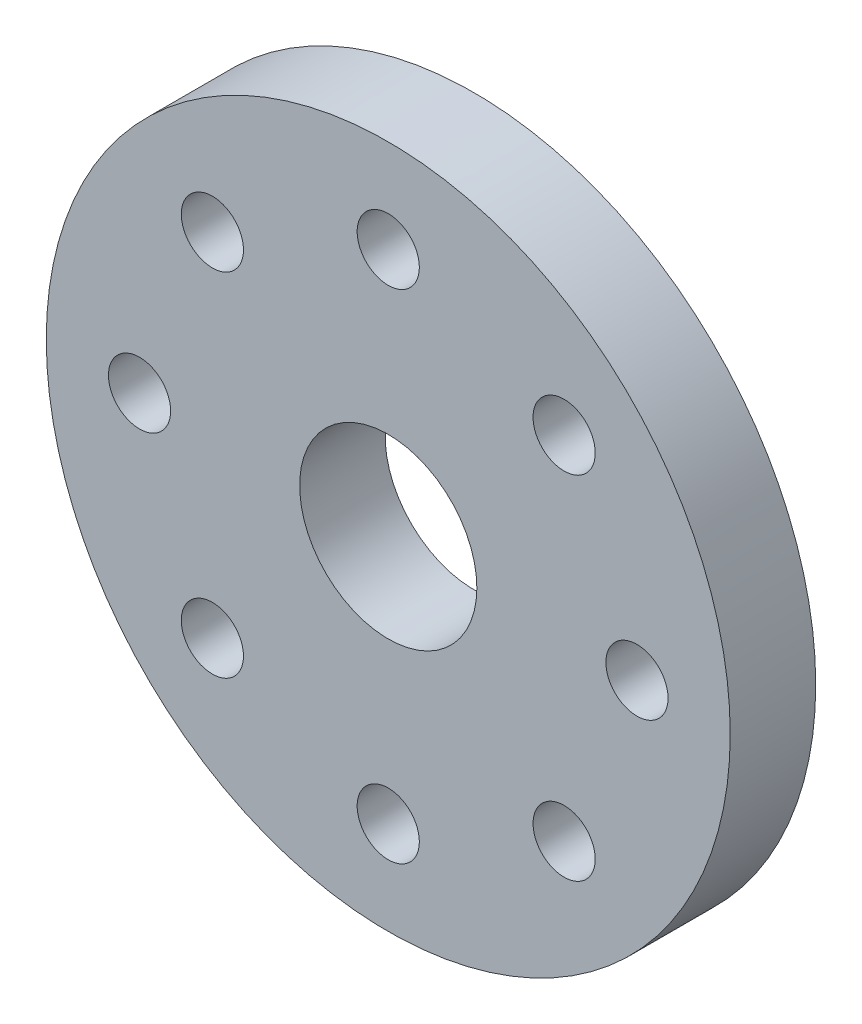
ISO-10303-21;
HEADER;
FILE_DESCRIPTION(('STEP AP214'),'2;1');
FILE_NAME('part.step','',(''),(''),'','','');
FILE_SCHEMA(('AUTOMOTIVE_DESIGN { 1 0 10303 214 1 1 1 1 }'));
ENDSEC;
DATA;
#1=APPLICATION_CONTEXT('core data for automotive mechanical design processes');
#2=APPLICATION_PROTOCOL_DEFINITION('international standard','automotive_design',2000,#1);
#3=PRODUCT_CONTEXT('',#1,'mechanical');
#4=PRODUCT('Part','Part','',(#3));
#5=PRODUCT_RELATED_PRODUCT_CATEGORY('part','',(#4));
#6=PRODUCT_DEFINITION_FORMATION('','',#4);
#7=PRODUCT_DEFINITION_CONTEXT('part definition',#1,'design');
#8=PRODUCT_DEFINITION('design','',#6,#7);
#9=PRODUCT_DEFINITION_SHAPE('','',#8);
#10=(LENGTH_UNIT() NAMED_UNIT(*) SI_UNIT(.MILLI.,.METRE.));
#11=(NAMED_UNIT(*) PLANE_ANGLE_UNIT() SI_UNIT($,.RADIAN.));
#12=(NAMED_UNIT(*) SI_UNIT($,.STERADIAN.) SOLID_ANGLE_UNIT());
#13=UNCERTAINTY_MEASURE_WITH_UNIT(LENGTH_MEASURE(1.E-05),#10,'distance_accuracy_value','');
#14=(GEOMETRIC_REPRESENTATION_CONTEXT(3) GLOBAL_UNCERTAINTY_ASSIGNED_CONTEXT((#13)) GLOBAL_UNIT_ASSIGNED_CONTEXT((#10,
#11,#12)) REPRESENTATION_CONTEXT('',''));
#15=CARTESIAN_POINT('',(0.,0.,0.));
#16=DIRECTION('',(0.,0.,1.));
#17=DIRECTION('',(1.,0.,0.));
#18=AXIS2_PLACEMENT_3D('',#15,#16,#17);
#19=CARTESIAN_POINT('',(0.,0.,2.75));
#20=DIRECTION('',(0.,0.,1.));
#21=DIRECTION('',(1.,0.,0.));
#22=AXIS2_PLACEMENT_3D('',#19,#20,#21);
#23=PLANE('',#22);
#24=CARTESIAN_POINT('',(0.,8.,2.75));
#25=DIRECTION('',(0.,0.,1.));
#26=DIRECTION('',(1.,0.,0.));
#27=AXIS2_PLACEMENT_3D('',#24,#25,#26);
#28=CIRCLE('',#27,1.);
#29=CARTESIAN_POINT('',(1.,8.,2.75));
#30=VERTEX_POINT('',#29);
#31=EDGE_CURVE('E122',#30,#30,#28,.T.);
#32=ORIENTED_EDGE('',*,*,#31,.F.);
#33=EDGE_LOOP('',(#32));
#34=FACE_BOUND('',#33,.T.);
#35=CARTESIAN_POINT('',(5.65685424949239,5.65685424949237,2.75));
#36=DIRECTION('',(0.,0.,1.));
#37=DIRECTION('',(1.,0.,0.));
#38=AXIS2_PLACEMENT_3D('',#35,#36,#37);
#39=CIRCLE('',#38,1.);
#40=CARTESIAN_POINT('',(6.65685424949239,5.65685424949237,2.75));
#41=VERTEX_POINT('',#40);
#42=EDGE_CURVE('E118',#41,#41,#39,.T.);
#43=ORIENTED_EDGE('',*,*,#42,.F.);
#44=EDGE_LOOP('',(#43));
#45=FACE_BOUND('',#44,.T.);
#46=CARTESIAN_POINT('',(8.,0.,2.75));
#47=DIRECTION('',(0.,0.,1.));
#48=DIRECTION('',(1.,0.,0.));
#49=AXIS2_PLACEMENT_3D('',#46,#47,#48);
#50=CIRCLE('',#49,1.);
#51=CARTESIAN_POINT('',(9.,0.,2.75));
#52=VERTEX_POINT('',#51);
#53=EDGE_CURVE('E110',#52,#52,#50,.T.);
#54=ORIENTED_EDGE('',*,*,#53,.F.);
#55=EDGE_LOOP('',(#54));
#56=FACE_BOUND('',#55,.T.);
#57=CARTESIAN_POINT('',(5.65685424949235,-5.65685424949241,2.75));
#58=DIRECTION('',(0.,0.,1.));
#59=DIRECTION('',(1.,0.,0.));
#60=AXIS2_PLACEMENT_3D('',#57,#58,#59);
#61=CIRCLE('',#60,1.);
#62=CARTESIAN_POINT('',(6.65685424949235,-5.65685424949241,2.75));
#63=VERTEX_POINT('',#62);
#64=EDGE_CURVE('E102',#63,#63,#61,.T.);
#65=ORIENTED_EDGE('',*,*,#64,.F.);
#66=EDGE_LOOP('',(#65));
#67=FACE_BOUND('',#66,.T.);
#68=CARTESIAN_POINT('',(0.,-8.,2.75));
#69=DIRECTION('',(0.,0.,1.));
#70=DIRECTION('',(1.,0.,0.));
#71=AXIS2_PLACEMENT_3D('',#68,#69,#70);
#72=CIRCLE('',#71,1.);
#73=CARTESIAN_POINT('',(0.999999999999944,-8.,2.75));
#74=VERTEX_POINT('',#73);
#75=EDGE_CURVE('E94',#74,#74,#72,.T.);
#76=ORIENTED_EDGE('',*,*,#75,.F.);
#77=EDGE_LOOP('',(#76));
#78=FACE_BOUND('',#77,.T.);
#79=CARTESIAN_POINT('',(-5.65685424949243,-5.65685424949233,2.75));
#80=DIRECTION('',(0.,0.,1.));
#81=DIRECTION('',(1.,0.,0.));
#82=AXIS2_PLACEMENT_3D('',#79,#80,#81);
#83=CIRCLE('',#82,1.);
#84=CARTESIAN_POINT('',(-4.65685424949243,-5.65685424949233,2.75));
#85=VERTEX_POINT('',#84);
#86=EDGE_CURVE('E86',#85,#85,#83,.T.);
#87=ORIENTED_EDGE('',*,*,#86,.F.);
#88=EDGE_LOOP('',(#87));
#89=FACE_BOUND('',#88,.T.);
#90=CARTESIAN_POINT('',(-8.,0.,2.75));
#91=DIRECTION('',(0.,0.,1.));
#92=DIRECTION('',(1.,0.,0.));
#93=AXIS2_PLACEMENT_3D('',#90,#91,#92);
#94=CIRCLE('',#93,1.);
#95=CARTESIAN_POINT('',(-7.,0.,2.75));
#96=VERTEX_POINT('',#95);
#97=EDGE_CURVE('E78',#96,#96,#94,.T.);
#98=ORIENTED_EDGE('',*,*,#97,.F.);
#99=EDGE_LOOP('',(#98));
#100=FACE_BOUND('',#99,.T.);
#101=CARTESIAN_POINT('',(-5.65685424949231,5.65685424949245,2.75));
#102=DIRECTION('',(0.,0.,1.));
#103=DIRECTION('',(1.,0.,0.));
#104=AXIS2_PLACEMENT_3D('',#101,#102,#103);
#105=CIRCLE('',#104,1.);
#106=CARTESIAN_POINT('',(-4.65685424949231,5.65685424949245,2.75));
#107=VERTEX_POINT('',#106);
#108=EDGE_CURVE('E70',#107,#107,#105,.T.);
#109=ORIENTED_EDGE('',*,*,#108,.F.);
#110=EDGE_LOOP('',(#109));
#111=FACE_BOUND('',#110,.T.);
#112=CARTESIAN_POINT('',(0.,0.,2.75));
#113=DIRECTION('',(0.,0.,1.));
#114=DIRECTION('',(1.,0.,0.));
#115=AXIS2_PLACEMENT_3D('',#112,#113,#114);
#116=CIRCLE('',#115,11.);
#117=CARTESIAN_POINT('',(11.,0.,2.75));
#118=VERTEX_POINT('',#117);
#119=EDGE_CURVE('E10',#118,#118,#116,.T.);
#120=ORIENTED_EDGE('',*,*,#119,.T.);
#121=EDGE_LOOP('',(#120));
#122=FACE_BOUND('',#121,.T.);
#123=CARTESIAN_POINT('',(0.,0.,2.75));
#124=DIRECTION('',(0.,0.,1.));
#125=DIRECTION('',(1.,0.,0.));
#126=AXIS2_PLACEMENT_3D('',#123,#124,#125);
#127=CIRCLE('',#126,2.85);
#128=CARTESIAN_POINT('',(2.85,0.,2.75));
#129=VERTEX_POINT('',#128);
#130=EDGE_CURVE('E56',#129,#129,#127,.T.);
#131=ORIENTED_EDGE('',*,*,#130,.F.);
#132=EDGE_LOOP('',(#131));
#133=FACE_BOUND('',#132,.T.);
#134=ADVANCED_FACE('F43',(#34,#45,#56,#67,#78,#89,#100,#111,#122,#133),#23,.T.);
#135=CARTESIAN_POINT('',(0.,0.,0.));
#136=DIRECTION('',(0.,0.,1.));
#137=DIRECTION('',(1.,0.,0.));
#138=AXIS2_PLACEMENT_3D('',#135,#136,#137);
#139=PLANE('',#138);
#140=CARTESIAN_POINT('',(0.,8.,0.));
#141=DIRECTION('',(0.,0.,1.));
#142=DIRECTION('',(1.,0.,0.));
#143=AXIS2_PLACEMENT_3D('',#140,#141,#142);
#144=CIRCLE('',#143,1.);
#145=CARTESIAN_POINT('',(1.,8.,0.));
#146=VERTEX_POINT('',#145);
#147=EDGE_CURVE('E62',#146,#146,#144,.T.);
#148=ORIENTED_EDGE('',*,*,#147,.T.);
#149=EDGE_LOOP('',(#148));
#150=FACE_BOUND('',#149,.T.);
#151=CARTESIAN_POINT('',(5.65685424949239,5.65685424949237,0.));
#152=DIRECTION('',(0.,0.,1.));
#153=DIRECTION('',(1.,0.,0.));
#154=AXIS2_PLACEMENT_3D('',#151,#152,#153);
#155=CIRCLE('',#154,1.);
#156=CARTESIAN_POINT('',(6.65685424949239,5.65685424949237,0.));
#157=VERTEX_POINT('',#156);
#158=EDGE_CURVE('E114',#157,#157,#155,.T.);
#159=ORIENTED_EDGE('',*,*,#158,.T.);
#160=EDGE_LOOP('',(#159));
#161=FACE_BOUND('',#160,.T.);
#162=CARTESIAN_POINT('',(8.,0.,0.));
#163=DIRECTION('',(0.,0.,1.));
#164=DIRECTION('',(1.,0.,0.));
#165=AXIS2_PLACEMENT_3D('',#162,#163,#164);
#166=CIRCLE('',#165,1.);
#167=CARTESIAN_POINT('',(9.,0.,0.));
#168=VERTEX_POINT('',#167);
#169=EDGE_CURVE('E106',#168,#168,#166,.T.);
#170=ORIENTED_EDGE('',*,*,#169,.T.);
#171=EDGE_LOOP('',(#170));
#172=FACE_BOUND('',#171,.T.);
#173=CARTESIAN_POINT('',(5.65685424949235,-5.65685424949241,0.));
#174=DIRECTION('',(0.,0.,1.));
#175=DIRECTION('',(1.,0.,0.));
#176=AXIS2_PLACEMENT_3D('',#173,#174,#175);
#177=CIRCLE('',#176,1.);
#178=CARTESIAN_POINT('',(6.65685424949235,-5.65685424949241,0.));
#179=VERTEX_POINT('',#178);
#180=EDGE_CURVE('E98',#179,#179,#177,.T.);
#181=ORIENTED_EDGE('',*,*,#180,.T.);
#182=EDGE_LOOP('',(#181));
#183=FACE_BOUND('',#182,.T.);
#184=CARTESIAN_POINT('',(0.,-8.,0.));
#185=DIRECTION('',(0.,0.,1.));
#186=DIRECTION('',(1.,0.,0.));
#187=AXIS2_PLACEMENT_3D('',#184,#185,#186);
#188=CIRCLE('',#187,1.);
#189=CARTESIAN_POINT('',(0.999999999999944,-8.,0.));
#190=VERTEX_POINT('',#189);
#191=EDGE_CURVE('E90',#190,#190,#188,.T.);
#192=ORIENTED_EDGE('',*,*,#191,.T.);
#193=EDGE_LOOP('',(#192));
#194=FACE_BOUND('',#193,.T.);
#195=CARTESIAN_POINT('',(-5.65685424949243,-5.65685424949233,0.));
#196=DIRECTION('',(0.,0.,1.));
#197=DIRECTION('',(1.,0.,0.));
#198=AXIS2_PLACEMENT_3D('',#195,#196,#197);
#199=CIRCLE('',#198,1.);
#200=CARTESIAN_POINT('',(-4.65685424949243,-5.65685424949233,0.));
#201=VERTEX_POINT('',#200);
#202=EDGE_CURVE('E82',#201,#201,#199,.T.);
#203=ORIENTED_EDGE('',*,*,#202,.T.);
#204=EDGE_LOOP('',(#203));
#205=FACE_BOUND('',#204,.T.);
#206=CARTESIAN_POINT('',(-8.,0.,0.));
#207=DIRECTION('',(0.,0.,1.));
#208=DIRECTION('',(1.,0.,0.));
#209=AXIS2_PLACEMENT_3D('',#206,#207,#208);
#210=CIRCLE('',#209,1.);
#211=CARTESIAN_POINT('',(-7.,0.,0.));
#212=VERTEX_POINT('',#211);
#213=EDGE_CURVE('E74',#212,#212,#210,.T.);
#214=ORIENTED_EDGE('',*,*,#213,.T.);
#215=EDGE_LOOP('',(#214));
#216=FACE_BOUND('',#215,.T.);
#217=CARTESIAN_POINT('',(-5.65685424949231,5.65685424949245,0.));
#218=DIRECTION('',(0.,0.,1.));
#219=DIRECTION('',(1.,0.,0.));
#220=AXIS2_PLACEMENT_3D('',#217,#218,#219);
#221=CIRCLE('',#220,1.);
#222=CARTESIAN_POINT('',(-4.65685424949231,5.65685424949245,0.));
#223=VERTEX_POINT('',#222);
#224=EDGE_CURVE('E66',#223,#223,#221,.T.);
#225=ORIENTED_EDGE('',*,*,#224,.T.);
#226=EDGE_LOOP('',(#225));
#227=FACE_BOUND('',#226,.T.);
#228=CARTESIAN_POINT('',(0.,0.,0.));
#229=DIRECTION('',(0.,0.,1.));
#230=DIRECTION('',(1.,0.,0.));
#231=AXIS2_PLACEMENT_3D('',#228,#229,#230);
#232=CIRCLE('',#231,11.);
#233=CARTESIAN_POINT('',(11.,0.,0.));
#234=VERTEX_POINT('',#233);
#235=EDGE_CURVE('E47',#234,#234,#232,.T.);
#236=ORIENTED_EDGE('',*,*,#235,.F.);
#237=EDGE_LOOP('',(#236));
#238=FACE_BOUND('',#237,.T.);
#239=CARTESIAN_POINT('',(0.,0.,0.));
#240=DIRECTION('',(0.,0.,1.));
#241=DIRECTION('',(1.,0.,0.));
#242=AXIS2_PLACEMENT_3D('',#239,#240,#241);
#243=CIRCLE('',#242,2.85);
#244=CARTESIAN_POINT('',(2.85,0.,0.));
#245=VERTEX_POINT('',#244);
#246=EDGE_CURVE('E58',#245,#245,#243,.T.);
#247=ORIENTED_EDGE('',*,*,#246,.T.);
#248=EDGE_LOOP('',(#247));
#249=FACE_BOUND('',#248,.T.);
#250=ADVANCED_FACE('F130',(#150,#161,#172,#183,#194,#205,#216,#227,#238,#249),#139,.F.);
#251=CARTESIAN_POINT('',(0.,0.,2.75));
#252=DIRECTION('',(0.,0.,-1.));
#253=DIRECTION('',(-1.,0.,0.));
#254=AXIS2_PLACEMENT_3D('',#251,#252,#253);
#255=CYLINDRICAL_SURFACE('',#254,11.);
#256=ORIENTED_EDGE('',*,*,#119,.F.);
#257=EDGE_LOOP('',(#256));
#258=FACE_BOUND('',#257,.T.);
#259=ORIENTED_EDGE('',*,*,#235,.T.);
#260=EDGE_LOOP('',(#259));
#261=FACE_BOUND('',#260,.T.);
#262=ADVANCED_FACE('F45',(#258,#261),#255,.T.);
#263=CARTESIAN_POINT('',(0.,0.,2.75));
#264=DIRECTION('',(0.,0.,-1.));
#265=DIRECTION('',(-1.,0.,0.));
#266=AXIS2_PLACEMENT_3D('',#263,#264,#265);
#267=CYLINDRICAL_SURFACE('',#266,2.85);
#268=ORIENTED_EDGE('',*,*,#130,.T.);
#269=EDGE_LOOP('',(#268));
#270=FACE_BOUND('',#269,.T.);
#271=ORIENTED_EDGE('',*,*,#246,.F.);
#272=EDGE_LOOP('',(#271));
#273=FACE_BOUND('',#272,.T.);
#274=ADVANCED_FACE('F159',(#270,#273),#267,.F.);
#275=CARTESIAN_POINT('',(-5.65685424949231,5.65685424949245,0.));
#276=DIRECTION('',(0.,0.,1.));
#277=DIRECTION('',(1.,0.,0.));
#278=AXIS2_PLACEMENT_3D('',#275,#276,#277);
#279=CYLINDRICAL_SURFACE('',#278,1.);
#280=ORIENTED_EDGE('',*,*,#224,.F.);
#281=EDGE_LOOP('',(#280));
#282=FACE_BOUND('',#281,.T.);
#283=ORIENTED_EDGE('',*,*,#108,.T.);
#284=EDGE_LOOP('',(#283));
#285=FACE_BOUND('',#284,.T.);
#286=ADVANCED_FACE('F162',(#282,#285),#279,.F.);
#287=CARTESIAN_POINT('',(-8.,0.,0.));
#288=DIRECTION('',(0.,0.,1.));
#289=DIRECTION('',(1.,0.,0.));
#290=AXIS2_PLACEMENT_3D('',#287,#288,#289);
#291=CYLINDRICAL_SURFACE('',#290,1.);
#292=ORIENTED_EDGE('',*,*,#213,.F.);
#293=EDGE_LOOP('',(#292));
#294=FACE_BOUND('',#293,.T.);
#295=ORIENTED_EDGE('',*,*,#97,.T.);
#296=EDGE_LOOP('',(#295));
#297=FACE_BOUND('',#296,.T.);
#298=ADVANCED_FACE('F174',(#294,#297),#291,.F.);
#299=CARTESIAN_POINT('',(-5.65685424949243,-5.65685424949233,0.));
#300=DIRECTION('',(0.,0.,1.));
#301=DIRECTION('',(1.,0.,0.));
#302=AXIS2_PLACEMENT_3D('',#299,#300,#301);
#303=CYLINDRICAL_SURFACE('',#302,1.);
#304=ORIENTED_EDGE('',*,*,#202,.F.);
#305=EDGE_LOOP('',(#304));
#306=FACE_BOUND('',#305,.T.);
#307=ORIENTED_EDGE('',*,*,#86,.T.);
#308=EDGE_LOOP('',(#307));
#309=FACE_BOUND('',#308,.T.);
#310=ADVANCED_FACE('F178',(#306,#309),#303,.F.);
#311=CARTESIAN_POINT('',(0.,-8.,0.));
#312=DIRECTION('',(0.,0.,1.));
#313=DIRECTION('',(1.,0.,0.));
#314=AXIS2_PLACEMENT_3D('',#311,#312,#313);
#315=CYLINDRICAL_SURFACE('',#314,1.);
#316=ORIENTED_EDGE('',*,*,#191,.F.);
#317=EDGE_LOOP('',(#316));
#318=FACE_BOUND('',#317,.T.);
#319=ORIENTED_EDGE('',*,*,#75,.T.);
#320=EDGE_LOOP('',(#319));
#321=FACE_BOUND('',#320,.T.);
#322=ADVANCED_FACE('F182',(#318,#321),#315,.F.);
#323=CARTESIAN_POINT('',(5.65685424949235,-5.65685424949241,0.));
#324=DIRECTION('',(0.,0.,1.));
#325=DIRECTION('',(1.,0.,0.));
#326=AXIS2_PLACEMENT_3D('',#323,#324,#325);
#327=CYLINDRICAL_SURFACE('',#326,1.);
#328=ORIENTED_EDGE('',*,*,#180,.F.);
#329=EDGE_LOOP('',(#328));
#330=FACE_BOUND('',#329,.T.);
#331=ORIENTED_EDGE('',*,*,#64,.T.);
#332=EDGE_LOOP('',(#331));
#333=FACE_BOUND('',#332,.T.);
#334=ADVANCED_FACE('F186',(#330,#333),#327,.F.);
#335=CARTESIAN_POINT('',(8.,0.,0.));
#336=DIRECTION('',(0.,0.,1.));
#337=DIRECTION('',(1.,0.,0.));
#338=AXIS2_PLACEMENT_3D('',#335,#336,#337);
#339=CYLINDRICAL_SURFACE('',#338,1.);
#340=ORIENTED_EDGE('',*,*,#169,.F.);
#341=EDGE_LOOP('',(#340));
#342=FACE_BOUND('',#341,.T.);
#343=ORIENTED_EDGE('',*,*,#53,.T.);
#344=EDGE_LOOP('',(#343));
#345=FACE_BOUND('',#344,.T.);
#346=ADVANCED_FACE('F190',(#342,#345),#339,.F.);
#347=CARTESIAN_POINT('',(5.65685424949239,5.65685424949237,0.));
#348=DIRECTION('',(0.,0.,1.));
#349=DIRECTION('',(1.,0.,0.));
#350=AXIS2_PLACEMENT_3D('',#347,#348,#349);
#351=CYLINDRICAL_SURFACE('',#350,1.);
#352=ORIENTED_EDGE('',*,*,#158,.F.);
#353=EDGE_LOOP('',(#352));
#354=FACE_BOUND('',#353,.T.);
#355=ORIENTED_EDGE('',*,*,#42,.T.);
#356=EDGE_LOOP('',(#355));
#357=FACE_BOUND('',#356,.T.);
#358=ADVANCED_FACE('F136',(#354,#357),#351,.F.);
#359=CARTESIAN_POINT('',(0.,8.,0.));
#360=DIRECTION('',(0.,0.,1.));
#361=DIRECTION('',(1.,0.,0.));
#362=AXIS2_PLACEMENT_3D('',#359,#360,#361);
#363=CYLINDRICAL_SURFACE('',#362,1.);
#364=ORIENTED_EDGE('',*,*,#147,.F.);
#365=EDGE_LOOP('',(#364));
#366=FACE_BOUND('',#365,.T.);
#367=ORIENTED_EDGE('',*,*,#31,.T.);
#368=EDGE_LOOP('',(#367));
#369=FACE_BOUND('',#368,.T.);
#370=ADVANCED_FACE('F133',(#366,#369),#363,.F.);
#371=CLOSED_SHELL('',(#134,#250,#262,#274,#286,#298,#310,#322,#334,#346,#358,#370));
#372=MANIFOLD_SOLID_BREP('B2',#371);
#373=ADVANCED_BREP_SHAPE_REPRESENTATION('',(#18,#372),#14);
#374=SHAPE_DEFINITION_REPRESENTATION(#9,#373);
ENDSEC;
END-ISO-10303-21;
